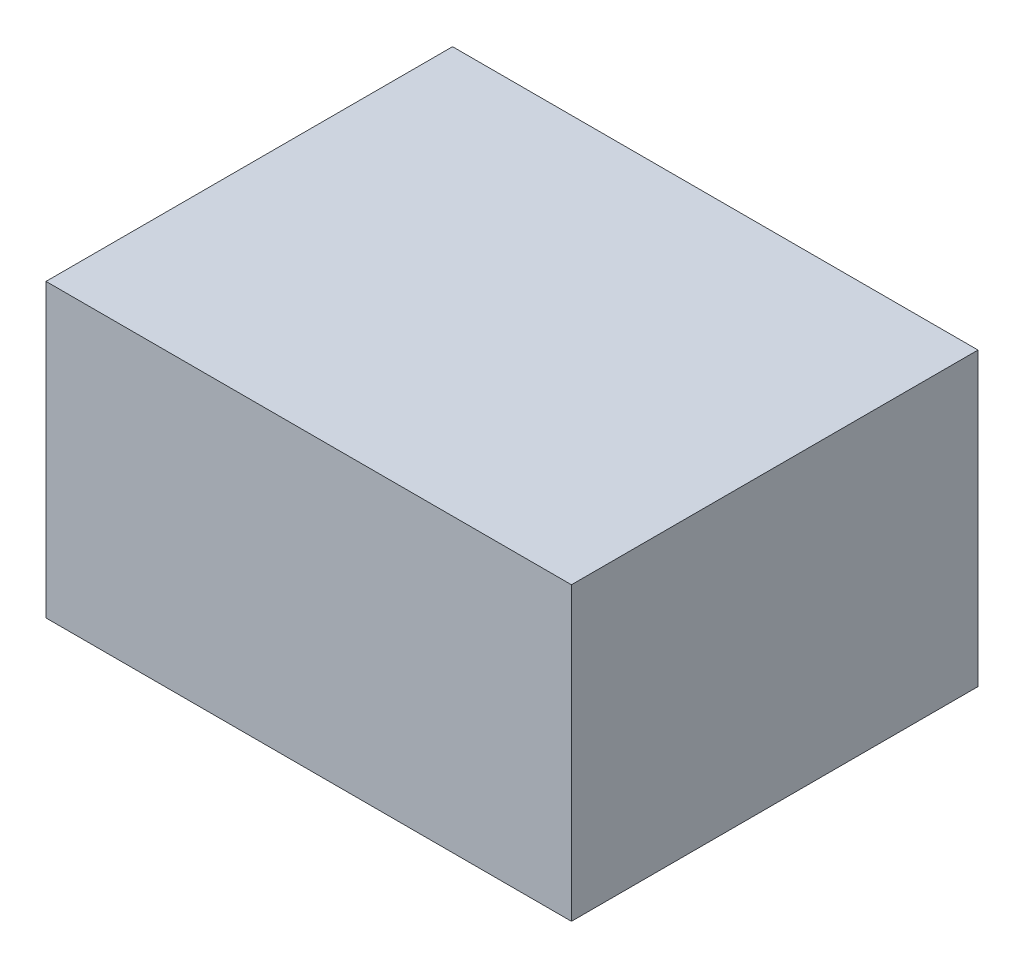
ISO-10303-21;
HEADER;
FILE_DESCRIPTION(('STEP AP214'),'2;1');
FILE_NAME('part.step','',(''),(''),'','','');
FILE_SCHEMA(('AUTOMOTIVE_DESIGN { 1 0 10303 214 1 1 1 1 }'));
ENDSEC;
DATA;
#1=APPLICATION_CONTEXT('core data for automotive mechanical design processes');
#2=APPLICATION_PROTOCOL_DEFINITION('international standard','automotive_design',2000,#1);
#3=PRODUCT_CONTEXT('',#1,'mechanical');
#4=PRODUCT('Part','Part','',(#3));
#5=PRODUCT_RELATED_PRODUCT_CATEGORY('part','',(#4));
#6=PRODUCT_DEFINITION_FORMATION('','',#4);
#7=PRODUCT_DEFINITION_CONTEXT('part definition',#1,'design');
#8=PRODUCT_DEFINITION('design','',#6,#7);
#9=PRODUCT_DEFINITION_SHAPE('','',#8);
#10=(LENGTH_UNIT() NAMED_UNIT(*) SI_UNIT(.MILLI.,.METRE.));
#11=(NAMED_UNIT(*) PLANE_ANGLE_UNIT() SI_UNIT($,.RADIAN.));
#12=(NAMED_UNIT(*) SI_UNIT($,.STERADIAN.) SOLID_ANGLE_UNIT());
#13=UNCERTAINTY_MEASURE_WITH_UNIT(LENGTH_MEASURE(1.E-05),#10,'distance_accuracy_value','');
#14=(GEOMETRIC_REPRESENTATION_CONTEXT(3) GLOBAL_UNCERTAINTY_ASSIGNED_CONTEXT((#13)) GLOBAL_UNIT_ASSIGNED_CONTEXT((#10,
#11,#12)) REPRESENTATION_CONTEXT('',''));
#15=CARTESIAN_POINT('',(0.,0.,0.));
#16=DIRECTION('',(0.,0.,1.));
#17=DIRECTION('',(1.,0.,0.));
#18=AXIS2_PLACEMENT_3D('',#15,#16,#17);
#19=CARTESIAN_POINT('',(34.25,38.,26.5));
#20=DIRECTION('',(-1.,0.,0.));
#21=DIRECTION('',(0.,0.,1.));
#22=AXIS2_PLACEMENT_3D('',#19,#20,#21);
#23=PLANE('',#22);
#24=DIRECTION('',(0.,0.,-1.));
#25=VECTOR('',#24,1.);
#26=CARTESIAN_POINT('',(34.25,0.,26.5));
#27=LINE('',#26,#25);
#28=CARTESIAN_POINT('',(34.25,0.,26.5));
#29=VERTEX_POINT('',#28);
#30=CARTESIAN_POINT('',(34.25,0.,-26.5));
#31=VERTEX_POINT('',#30);
#32=EDGE_CURVE('E102',#29,#31,#27,.T.);
#33=ORIENTED_EDGE('',*,*,#32,.T.);
#34=DIRECTION('',(0.,-1.,0.));
#35=VECTOR('',#34,1.);
#36=CARTESIAN_POINT('',(34.25,38.,-26.5));
#37=LINE('',#36,#35);
#38=CARTESIAN_POINT('',(34.25,38.,-26.5));
#39=VERTEX_POINT('',#38);
#40=EDGE_CURVE('E11',#39,#31,#37,.T.);
#41=ORIENTED_EDGE('',*,*,#40,.F.);
#42=DIRECTION('',(0.,0.,-1.));
#43=VECTOR('',#42,1.);
#44=CARTESIAN_POINT('',(34.25,38.,26.5));
#45=LINE('',#44,#43);
#46=CARTESIAN_POINT('',(34.25,38.,26.5));
#47=VERTEX_POINT('',#46);
#48=EDGE_CURVE('E90',#47,#39,#45,.T.);
#49=ORIENTED_EDGE('',*,*,#48,.F.);
#50=DIRECTION('',(0.,-1.,0.));
#51=VECTOR('',#50,1.);
#52=CARTESIAN_POINT('',(34.25,38.,26.5));
#53=LINE('',#52,#51);
#54=EDGE_CURVE('E98',#47,#29,#53,.T.);
#55=ORIENTED_EDGE('',*,*,#54,.T.);
#56=EDGE_LOOP('',(#33,#41,#49,#55));
#57=FACE_BOUND('',#56,.T.);
#58=ADVANCED_FACE('F39',(#57),#23,.F.);
#59=CARTESIAN_POINT('',(-34.25,38.,-26.5));
#60=DIRECTION('',(0.,0.,1.));
#61=DIRECTION('',(1.,0.,0.));
#62=AXIS2_PLACEMENT_3D('',#59,#60,#61);
#63=PLANE('',#62);
#64=DIRECTION('',(-1.,0.,0.));
#65=VECTOR('',#64,1.);
#66=CARTESIAN_POINT('',(-34.25,0.,-26.5));
#67=LINE('',#66,#65);
#68=CARTESIAN_POINT('',(-34.25,0.,-26.5));
#69=VERTEX_POINT('',#68);
#70=EDGE_CURVE('E94',#31,#69,#67,.T.);
#71=ORIENTED_EDGE('',*,*,#70,.T.);
#72=DIRECTION('',(0.,-1.,0.));
#73=VECTOR('',#72,1.);
#74=CARTESIAN_POINT('',(-34.25,38.,-26.5));
#75=LINE('',#74,#73);
#76=CARTESIAN_POINT('',(-34.25,38.,-26.5));
#77=VERTEX_POINT('',#76);
#78=EDGE_CURVE('E47',#77,#69,#75,.T.);
#79=ORIENTED_EDGE('',*,*,#78,.F.);
#80=DIRECTION('',(-1.,0.,0.));
#81=VECTOR('',#80,1.);
#82=CARTESIAN_POINT('',(-34.25,38.,-26.5));
#83=LINE('',#82,#81);
#84=EDGE_CURVE('E85',#39,#77,#83,.T.);
#85=ORIENTED_EDGE('',*,*,#84,.F.);
#86=ORIENTED_EDGE('',*,*,#40,.T.);
#87=EDGE_LOOP('',(#71,#79,#85,#86));
#88=FACE_BOUND('',#87,.T.);
#89=ADVANCED_FACE('F93',(#88),#63,.F.);
#90=CARTESIAN_POINT('',(-34.25,38.,26.5));
#91=DIRECTION('',(1.,0.,0.));
#92=DIRECTION('',(0.,0.,-1.));
#93=AXIS2_PLACEMENT_3D('',#90,#91,#92);
#94=PLANE('',#93);
#95=DIRECTION('',(0.,0.,1.));
#96=VECTOR('',#95,1.);
#97=CARTESIAN_POINT('',(-34.25,0.,26.5));
#98=LINE('',#97,#96);
#99=CARTESIAN_POINT('',(-34.25,0.,26.5));
#100=VERTEX_POINT('',#99);
#101=EDGE_CURVE('E72',#69,#100,#98,.T.);
#102=ORIENTED_EDGE('',*,*,#101,.T.);
#103=DIRECTION('',(0.,-1.,0.));
#104=VECTOR('',#103,1.);
#105=CARTESIAN_POINT('',(-34.25,38.,26.5));
#106=LINE('',#105,#104);
#107=CARTESIAN_POINT('',(-34.25,38.,26.5));
#108=VERTEX_POINT('',#107);
#109=EDGE_CURVE('E95',#108,#100,#106,.T.);
#110=ORIENTED_EDGE('',*,*,#109,.F.);
#111=DIRECTION('',(0.,0.,1.));
#112=VECTOR('',#111,1.);
#113=CARTESIAN_POINT('',(-34.25,38.,26.5));
#114=LINE('',#113,#112);
#115=EDGE_CURVE('E88',#77,#108,#114,.T.);
#116=ORIENTED_EDGE('',*,*,#115,.F.);
#117=ORIENTED_EDGE('',*,*,#78,.T.);
#118=EDGE_LOOP('',(#102,#110,#116,#117));
#119=FACE_BOUND('',#118,.T.);
#120=ADVANCED_FACE('F96',(#119),#94,.F.);
#121=CARTESIAN_POINT('',(-34.25,38.,26.5));
#122=DIRECTION('',(0.,0.,-1.));
#123=DIRECTION('',(-1.,0.,0.));
#124=AXIS2_PLACEMENT_3D('',#121,#122,#123);
#125=PLANE('',#124);
#126=DIRECTION('',(1.,0.,0.));
#127=VECTOR('',#126,1.);
#128=CARTESIAN_POINT('',(-34.25,0.,26.5));
#129=LINE('',#128,#127);
#130=EDGE_CURVE('E78',#100,#29,#129,.T.);
#131=ORIENTED_EDGE('',*,*,#130,.T.);
#132=ORIENTED_EDGE('',*,*,#54,.F.);
#133=DIRECTION('',(1.,0.,0.));
#134=VECTOR('',#133,1.);
#135=CARTESIAN_POINT('',(-34.25,38.,26.5));
#136=LINE('',#135,#134);
#137=EDGE_CURVE('E55',#108,#47,#136,.T.);
#138=ORIENTED_EDGE('',*,*,#137,.F.);
#139=ORIENTED_EDGE('',*,*,#109,.T.);
#140=EDGE_LOOP('',(#131,#132,#138,#139));
#141=FACE_BOUND('',#140,.T.);
#142=ADVANCED_FACE('F109',(#141),#125,.F.);
#143=CARTESIAN_POINT('',(0.,38.,0.));
#144=DIRECTION('',(0.,-1.,0.));
#145=DIRECTION('',(0.,0.,-1.));
#146=AXIS2_PLACEMENT_3D('',#143,#144,#145);
#147=PLANE('',#146);
#148=ORIENTED_EDGE('',*,*,#48,.T.);
#149=ORIENTED_EDGE('',*,*,#84,.T.);
#150=ORIENTED_EDGE('',*,*,#115,.T.);
#151=ORIENTED_EDGE('',*,*,#137,.T.);
#152=EDGE_LOOP('',(#148,#149,#150,#151));
#153=FACE_BOUND('',#152,.T.);
#154=ADVANCED_FACE('F86',(#153),#147,.F.);
#155=CARTESIAN_POINT('',(0.,0.,0.));
#156=DIRECTION('',(0.,-1.,0.));
#157=DIRECTION('',(0.,0.,-1.));
#158=AXIS2_PLACEMENT_3D('',#155,#156,#157);
#159=PLANE('',#158);
#160=ORIENTED_EDGE('',*,*,#32,.F.);
#161=ORIENTED_EDGE('',*,*,#130,.F.);
#162=ORIENTED_EDGE('',*,*,#101,.F.);
#163=ORIENTED_EDGE('',*,*,#70,.F.);
#164=EDGE_LOOP('',(#160,#161,#162,#163));
#165=FACE_BOUND('',#164,.T.);
#166=ADVANCED_FACE('F112',(#165),#159,.T.);
#167=CLOSED_SHELL('',(#58,#89,#120,#142,#154,#166));
#168=MANIFOLD_SOLID_BREP('B2',#167);
#169=ADVANCED_BREP_SHAPE_REPRESENTATION('',(#18,#168),#14);
#170=SHAPE_DEFINITION_REPRESENTATION(#9,#169);
ENDSEC;
END-ISO-10303-21;
